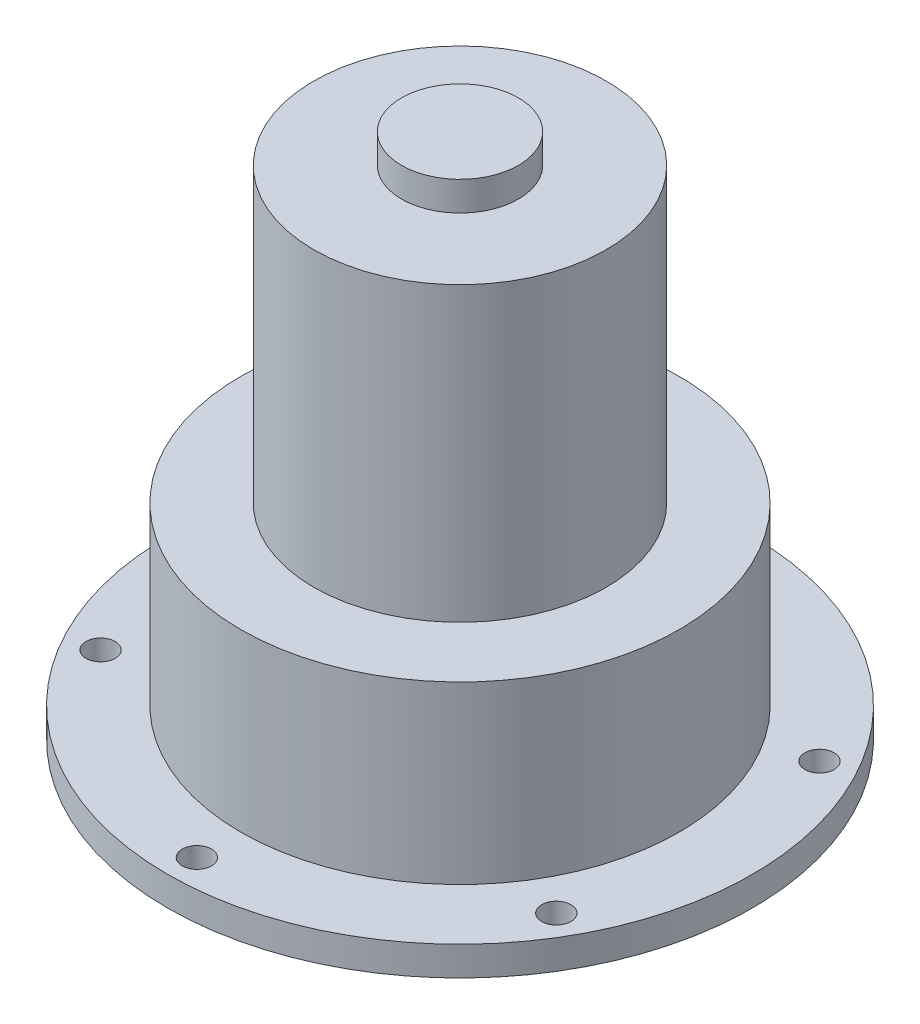
ISO-10303-21;
HEADER;
FILE_DESCRIPTION(('STEP AP214'),'2;1');
FILE_NAME('part.step','',(''),(''),'','','');
FILE_SCHEMA(('AUTOMOTIVE_DESIGN { 1 0 10303 214 1 1 1 1 }'));
ENDSEC;
DATA;
#1=APPLICATION_CONTEXT('core data for automotive mechanical design processes');
#2=APPLICATION_PROTOCOL_DEFINITION('international standard','automotive_design',2000,#1);
#3=PRODUCT_CONTEXT('',#1,'mechanical');
#4=PRODUCT('Part','Part','',(#3));
#5=PRODUCT_RELATED_PRODUCT_CATEGORY('part','',(#4));
#6=PRODUCT_DEFINITION_FORMATION('','',#4);
#7=PRODUCT_DEFINITION_CONTEXT('part definition',#1,'design');
#8=PRODUCT_DEFINITION('design','',#6,#7);
#9=PRODUCT_DEFINITION_SHAPE('','',#8);
#10=(LENGTH_UNIT() NAMED_UNIT(*) SI_UNIT(.MILLI.,.METRE.));
#11=(NAMED_UNIT(*) PLANE_ANGLE_UNIT() SI_UNIT($,.RADIAN.));
#12=(NAMED_UNIT(*) SI_UNIT($,.STERADIAN.) SOLID_ANGLE_UNIT());
#13=UNCERTAINTY_MEASURE_WITH_UNIT(LENGTH_MEASURE(1.E-05),#10,'distance_accuracy_value','');
#14=(GEOMETRIC_REPRESENTATION_CONTEXT(3) GLOBAL_UNCERTAINTY_ASSIGNED_CONTEXT((#13)) GLOBAL_UNIT_ASSIGNED_CONTEXT((#10,
#11,#12)) REPRESENTATION_CONTEXT('',''));
#15=CARTESIAN_POINT('',(0.,0.,0.));
#16=DIRECTION('',(0.,0.,1.));
#17=DIRECTION('',(1.,0.,0.));
#18=AXIS2_PLACEMENT_3D('',#15,#16,#17);
#19=CARTESIAN_POINT('',(0.,30.,0.));
#20=DIRECTION('',(0.,-1.,0.));
#21=DIRECTION('',(0.,0.,-1.));
#22=AXIS2_PLACEMENT_3D('',#19,#20,#21);
#23=CYLINDRICAL_SURFACE('',#22,37.5);
#24=CARTESIAN_POINT('',(0.,30.,0.));
#25=DIRECTION('',(0.,1.,0.));
#26=DIRECTION('',(0.,0.,1.));
#27=AXIS2_PLACEMENT_3D('',#24,#25,#26);
#28=CIRCLE('',#27,37.5);
#29=CARTESIAN_POINT('',(0.,30.,37.5));
#30=VERTEX_POINT('',#29);
#31=EDGE_CURVE('E43',#30,#30,#28,.T.);
#32=ORIENTED_EDGE('',*,*,#31,.F.);
#33=EDGE_LOOP('',(#32));
#34=FACE_BOUND('',#33,.T.);
#35=CARTESIAN_POINT('',(0.,0.,0.));
#36=DIRECTION('',(0.,1.,0.));
#37=DIRECTION('',(0.,0.,1.));
#38=AXIS2_PLACEMENT_3D('',#35,#36,#37);
#39=CIRCLE('',#38,37.5);
#40=CARTESIAN_POINT('',(0.,0.,37.5));
#41=VERTEX_POINT('',#40);
#42=EDGE_CURVE('E34',#41,#41,#39,.T.);
#43=ORIENTED_EDGE('',*,*,#42,.T.);
#44=EDGE_LOOP('',(#43));
#45=FACE_BOUND('',#44,.T.);
#46=ADVANCED_FACE('F31',(#34,#45),#23,.T.);
#47=CARTESIAN_POINT('',(0.,30.,0.));
#48=DIRECTION('',(0.,1.,0.));
#49=DIRECTION('',(0.,0.,1.));
#50=AXIS2_PLACEMENT_3D('',#47,#48,#49);
#51=PLANE('',#50);
#52=CARTESIAN_POINT('',(0.,30.,0.));
#53=DIRECTION('',(0.,1.,0.));
#54=DIRECTION('',(0.,0.,1.));
#55=AXIS2_PLACEMENT_3D('',#52,#53,#54);
#56=CIRCLE('',#55,25.);
#57=CARTESIAN_POINT('',(0.,30.,25.));
#58=VERTEX_POINT('',#57);
#59=EDGE_CURVE('E38',#58,#58,#56,.T.);
#60=ORIENTED_EDGE('',*,*,#59,.F.);
#61=EDGE_LOOP('',(#60));
#62=FACE_BOUND('',#61,.T.);
#63=ORIENTED_EDGE('',*,*,#31,.T.);
#64=EDGE_LOOP('',(#63));
#65=FACE_BOUND('',#64,.T.);
#66=ADVANCED_FACE('F54',(#62,#65),#51,.T.);
#67=CARTESIAN_POINT('',(0.,80.,0.));
#68=DIRECTION('',(0.,-1.,0.));
#69=DIRECTION('',(0.,0.,-1.));
#70=AXIS2_PLACEMENT_3D('',#67,#68,#69);
#71=CYLINDRICAL_SURFACE('',#70,25.);
#72=CARTESIAN_POINT('',(0.,80.,0.));
#73=DIRECTION('',(0.,1.,0.));
#74=DIRECTION('',(0.,0.,1.));
#75=AXIS2_PLACEMENT_3D('',#72,#73,#74);
#76=CIRCLE('',#75,25.);
#77=CARTESIAN_POINT('',(0.,80.,25.));
#78=VERTEX_POINT('',#77);
#79=EDGE_CURVE('E49',#78,#78,#76,.T.);
#80=ORIENTED_EDGE('',*,*,#79,.F.);
#81=EDGE_LOOP('',(#80));
#82=FACE_BOUND('',#81,.T.);
#83=ORIENTED_EDGE('',*,*,#59,.T.);
#84=EDGE_LOOP('',(#83));
#85=FACE_BOUND('',#84,.T.);
#86=ADVANCED_FACE('F169',(#82,#85),#71,.T.);
#87=CARTESIAN_POINT('',(0.,80.,0.));
#88=DIRECTION('',(0.,1.,0.));
#89=DIRECTION('',(0.,0.,1.));
#90=AXIS2_PLACEMENT_3D('',#87,#88,#89);
#91=PLANE('',#90);
#92=CARTESIAN_POINT('',(0.,80.,0.));
#93=DIRECTION('',(0.,1.,0.));
#94=DIRECTION('',(0.,0.,1.));
#95=AXIS2_PLACEMENT_3D('',#92,#93,#94);
#96=CIRCLE('',#95,10.);
#97=CARTESIAN_POINT('',(0.,80.,10.));
#98=VERTEX_POINT('',#97);
#99=EDGE_CURVE('E10',#98,#98,#96,.T.);
#100=ORIENTED_EDGE('',*,*,#99,.F.);
#101=EDGE_LOOP('',(#100));
#102=FACE_BOUND('',#101,.T.);
#103=ORIENTED_EDGE('',*,*,#79,.T.);
#104=EDGE_LOOP('',(#103));
#105=FACE_BOUND('',#104,.T.);
#106=ADVANCED_FACE('F165',(#102,#105),#91,.T.);
#107=CARTESIAN_POINT('',(0.,85.,0.));
#108=DIRECTION('',(0.,-1.,0.));
#109=DIRECTION('',(0.,0.,-1.));
#110=AXIS2_PLACEMENT_3D('',#107,#108,#109);
#111=CYLINDRICAL_SURFACE('',#110,10.);
#112=CARTESIAN_POINT('',(0.,85.,0.));
#113=DIRECTION('',(0.,1.,0.));
#114=DIRECTION('',(0.,0.,1.));
#115=AXIS2_PLACEMENT_3D('',#112,#113,#114);
#116=CIRCLE('',#115,10.);
#117=CARTESIAN_POINT('',(0.,85.,10.));
#118=VERTEX_POINT('',#117);
#119=EDGE_CURVE('E47',#118,#118,#116,.T.);
#120=ORIENTED_EDGE('',*,*,#119,.F.);
#121=EDGE_LOOP('',(#120));
#122=FACE_BOUND('',#121,.T.);
#123=ORIENTED_EDGE('',*,*,#99,.T.);
#124=EDGE_LOOP('',(#123));
#125=FACE_BOUND('',#124,.T.);
#126=ADVANCED_FACE('F161',(#122,#125),#111,.T.);
#127=CARTESIAN_POINT('',(0.,85.,0.));
#128=DIRECTION('',(0.,1.,0.));
#129=DIRECTION('',(0.,0.,1.));
#130=AXIS2_PLACEMENT_3D('',#127,#128,#129);
#131=PLANE('',#130);
#132=ORIENTED_EDGE('',*,*,#119,.T.);
#133=EDGE_LOOP('',(#132));
#134=FACE_BOUND('',#133,.T.);
#135=ADVANCED_FACE('F157',(#134),#131,.T.);
#136=CARTESIAN_POINT('',(0.,-5.,0.));
#137=DIRECTION('',(0.,1.,0.));
#138=DIRECTION('',(0.,0.,1.));
#139=AXIS2_PLACEMENT_3D('',#136,#137,#138);
#140=CYLINDRICAL_SURFACE('',#139,50.);
#141=CARTESIAN_POINT('',(0.,-5.,0.));
#142=DIRECTION('',(0.,-1.,0.));
#143=DIRECTION('',(0.,0.,-1.));
#144=AXIS2_PLACEMENT_3D('',#141,#142,#143);
#145=CIRCLE('',#144,50.);
#146=CARTESIAN_POINT('',(0.,-5.,-50.));
#147=VERTEX_POINT('',#146);
#148=EDGE_CURVE('E61',#147,#147,#145,.T.);
#149=ORIENTED_EDGE('',*,*,#148,.F.);
#150=EDGE_LOOP('',(#149));
#151=FACE_BOUND('',#150,.T.);
#152=CARTESIAN_POINT('',(0.,0.,0.));
#153=DIRECTION('',(0.,-1.,0.));
#154=DIRECTION('',(0.,0.,-1.));
#155=AXIS2_PLACEMENT_3D('',#152,#153,#154);
#156=CIRCLE('',#155,50.);
#157=CARTESIAN_POINT('',(0.,0.,-50.));
#158=VERTEX_POINT('',#157);
#159=EDGE_CURVE('E64',#158,#158,#156,.T.);
#160=ORIENTED_EDGE('',*,*,#159,.T.);
#161=EDGE_LOOP('',(#160));
#162=FACE_BOUND('',#161,.T.);
#163=ADVANCED_FACE('F120',(#151,#162),#140,.T.);
#164=CARTESIAN_POINT('',(0.,-5.,0.));
#165=DIRECTION('',(0.,-1.,0.));
#166=DIRECTION('',(0.,0.,-1.));
#167=AXIS2_PLACEMENT_3D('',#164,#165,#166);
#168=PLANE('',#167);
#169=CARTESIAN_POINT('',(0.,-5.,45.));
#170=DIRECTION('',(0.,-1.,0.));
#171=DIRECTION('',(0.,0.,-1.));
#172=AXIS2_PLACEMENT_3D('',#169,#170,#171);
#173=CIRCLE('',#172,2.5);
#174=CARTESIAN_POINT('',(0.,-5.,42.5));
#175=VERTEX_POINT('',#174);
#176=EDGE_CURVE('E96',#175,#175,#173,.T.);
#177=ORIENTED_EDGE('',*,*,#176,.F.);
#178=EDGE_LOOP('',(#177));
#179=FACE_BOUND('',#178,.T.);
#180=CARTESIAN_POINT('',(-38.9711431702988,-5.,22.4999999999983));
#181=DIRECTION('',(0.,-1.,0.));
#182=DIRECTION('',(0.,0.,-1.));
#183=AXIS2_PLACEMENT_3D('',#180,#181,#182);
#184=CIRCLE('',#183,2.50000000000193);
#185=CARTESIAN_POINT('',(-38.9711431702988,-5.,19.9999999999964));
#186=VERTEX_POINT('',#185);
#187=EDGE_CURVE('E97',#186,#186,#184,.T.);
#188=ORIENTED_EDGE('',*,*,#187,.F.);
#189=EDGE_LOOP('',(#188));
#190=FACE_BOUND('',#189,.T.);
#191=CARTESIAN_POINT('',(-38.9711431702969,-5.,-22.5000000000017));
#192=DIRECTION('',(0.,-1.,0.));
#193=DIRECTION('',(0.,0.,-1.));
#194=AXIS2_PLACEMENT_3D('',#191,#192,#193);
#195=CIRCLE('',#194,2.50000000000364);
#196=CARTESIAN_POINT('',(-38.9711431702969,-5.,-25.0000000000053));
#197=VERTEX_POINT('',#196);
#198=EDGE_CURVE('E71',#197,#197,#195,.T.);
#199=ORIENTED_EDGE('',*,*,#198,.F.);
#200=EDGE_LOOP('',(#199));
#201=FACE_BOUND('',#200,.T.);
#202=CARTESIAN_POINT('',(3.82039804131605E-12,-5.,-45.));
#203=DIRECTION('',(0.,-1.,0.));
#204=DIRECTION('',(0.,0.,-1.));
#205=AXIS2_PLACEMENT_3D('',#202,#203,#204);
#206=CIRCLE('',#205,2.50000000000396);
#207=CARTESIAN_POINT('',(3.82039804131605E-12,-5.,-47.500000000004));
#208=VERTEX_POINT('',#207);
#209=EDGE_CURVE('E78',#208,#208,#206,.T.);
#210=ORIENTED_EDGE('',*,*,#209,.F.);
#211=EDGE_LOOP('',(#210));
#212=FACE_BOUND('',#211,.T.);
#213=CARTESIAN_POINT('',(38.9711431703026,-5.,-22.4999999999983));
#214=DIRECTION('',(0.,-1.,0.));
#215=DIRECTION('',(0.,0.,-1.));
#216=AXIS2_PLACEMENT_3D('',#213,#214,#215);
#217=CIRCLE('',#216,2.50000000000246);
#218=CARTESIAN_POINT('',(38.9711431703026,-5.,-25.0000000000008));
#219=VERTEX_POINT('',#218);
#220=EDGE_CURVE('E84',#219,#219,#217,.T.);
#221=ORIENTED_EDGE('',*,*,#220,.F.);
#222=EDGE_LOOP('',(#221));
#223=FACE_BOUND('',#222,.T.);
#224=CARTESIAN_POINT('',(38.9711431703007,-5.,22.5000000000017));
#225=DIRECTION('',(0.,-1.,0.));
#226=DIRECTION('',(0.,0.,-1.));
#227=AXIS2_PLACEMENT_3D('',#224,#225,#226);
#228=CIRCLE('',#227,2.50000000000054);
#229=CARTESIAN_POINT('',(38.9711431703007,-5.,20.0000000000011));
#230=VERTEX_POINT('',#229);
#231=EDGE_CURVE('E90',#230,#230,#228,.T.);
#232=ORIENTED_EDGE('',*,*,#231,.F.);
#233=EDGE_LOOP('',(#232));
#234=FACE_BOUND('',#233,.T.);
#235=ORIENTED_EDGE('',*,*,#148,.T.);
#236=EDGE_LOOP('',(#235));
#237=FACE_BOUND('',#236,.T.);
#238=ADVANCED_FACE('F117',(#179,#190,#201,#212,#223,#234,#237),#168,.T.);
#239=CARTESIAN_POINT('',(0.,0.,0.));
#240=DIRECTION('',(0.,-1.,0.));
#241=DIRECTION('',(0.,0.,-1.));
#242=AXIS2_PLACEMENT_3D('',#239,#240,#241);
#243=PLANE('',#242);
#244=CARTESIAN_POINT('',(0.,0.,45.));
#245=DIRECTION('',(0.,-1.,0.));
#246=DIRECTION('',(0.,0.,-1.));
#247=AXIS2_PLACEMENT_3D('',#244,#245,#246);
#248=CIRCLE('',#247,2.5);
#249=CARTESIAN_POINT('',(0.,0.,42.5));
#250=VERTEX_POINT('',#249);
#251=EDGE_CURVE('E69',#250,#250,#248,.T.);
#252=ORIENTED_EDGE('',*,*,#251,.T.);
#253=EDGE_LOOP('',(#252));
#254=FACE_BOUND('',#253,.T.);
#255=CARTESIAN_POINT('',(-38.9711431702988,0.,22.4999999999983));
#256=DIRECTION('',(0.,-1.,0.));
#257=DIRECTION('',(0.,0.,-1.));
#258=AXIS2_PLACEMENT_3D('',#255,#256,#257);
#259=CIRCLE('',#258,2.50000000000193);
#260=CARTESIAN_POINT('',(-38.9711431702988,0.,19.9999999999964));
#261=VERTEX_POINT('',#260);
#262=EDGE_CURVE('E75',#261,#261,#259,.T.);
#263=ORIENTED_EDGE('',*,*,#262,.T.);
#264=EDGE_LOOP('',(#263));
#265=FACE_BOUND('',#264,.T.);
#266=CARTESIAN_POINT('',(-38.9711431702969,0.,-22.5000000000017));
#267=DIRECTION('',(0.,-1.,0.));
#268=DIRECTION('',(0.,0.,-1.));
#269=AXIS2_PLACEMENT_3D('',#266,#267,#268);
#270=CIRCLE('',#269,2.50000000000364);
#271=CARTESIAN_POINT('',(-38.9711431702969,0.,-25.0000000000053));
#272=VERTEX_POINT('',#271);
#273=EDGE_CURVE('E74',#272,#272,#270,.T.);
#274=ORIENTED_EDGE('',*,*,#273,.T.);
#275=EDGE_LOOP('',(#274));
#276=FACE_BOUND('',#275,.T.);
#277=CARTESIAN_POINT('',(3.82039804131605E-12,0.,-45.));
#278=DIRECTION('',(0.,-1.,0.));
#279=DIRECTION('',(0.,0.,-1.));
#280=AXIS2_PLACEMENT_3D('',#277,#278,#279);
#281=CIRCLE('',#280,2.50000000000396);
#282=CARTESIAN_POINT('',(3.82039804131605E-12,0.,-47.500000000004));
#283=VERTEX_POINT('',#282);
#284=EDGE_CURVE('E81',#283,#283,#281,.T.);
#285=ORIENTED_EDGE('',*,*,#284,.T.);
#286=EDGE_LOOP('',(#285));
#287=FACE_BOUND('',#286,.T.);
#288=CARTESIAN_POINT('',(38.9711431703026,0.,-22.4999999999983));
#289=DIRECTION('',(0.,-1.,0.));
#290=DIRECTION('',(0.,0.,-1.));
#291=AXIS2_PLACEMENT_3D('',#288,#289,#290);
#292=CIRCLE('',#291,2.50000000000246);
#293=CARTESIAN_POINT('',(38.9711431703026,0.,-25.0000000000008));
#294=VERTEX_POINT('',#293);
#295=EDGE_CURVE('E87',#294,#294,#292,.T.);
#296=ORIENTED_EDGE('',*,*,#295,.T.);
#297=EDGE_LOOP('',(#296));
#298=FACE_BOUND('',#297,.T.);
#299=CARTESIAN_POINT('',(38.9711431703007,0.,22.5000000000017));
#300=DIRECTION('',(0.,-1.,0.));
#301=DIRECTION('',(0.,0.,-1.));
#302=AXIS2_PLACEMENT_3D('',#299,#300,#301);
#303=CIRCLE('',#302,2.50000000000054);
#304=CARTESIAN_POINT('',(38.9711431703007,0.,20.0000000000011));
#305=VERTEX_POINT('',#304);
#306=EDGE_CURVE('E93',#305,#305,#303,.T.);
#307=ORIENTED_EDGE('',*,*,#306,.T.);
#308=EDGE_LOOP('',(#307));
#309=FACE_BOUND('',#308,.T.);
#310=ORIENTED_EDGE('',*,*,#42,.F.);
#311=EDGE_LOOP('',(#310));
#312=FACE_BOUND('',#311,.T.);
#313=ORIENTED_EDGE('',*,*,#159,.F.);
#314=EDGE_LOOP('',(#313));
#315=FACE_BOUND('',#314,.T.);
#316=ADVANCED_FACE('F107',(#254,#265,#276,#287,#298,#309,#312,#315),#243,.F.);
#317=CARTESIAN_POINT('',(38.9711431703007,0.,22.5000000000017));
#318=DIRECTION('',(0.,-1.,0.));
#319=DIRECTION('',(0.,0.,-1.));
#320=AXIS2_PLACEMENT_3D('',#317,#318,#319);
#321=CYLINDRICAL_SURFACE('',#320,2.50000000000054);
#322=ORIENTED_EDGE('',*,*,#306,.F.);
#323=EDGE_LOOP('',(#322));
#324=FACE_BOUND('',#323,.T.);
#325=ORIENTED_EDGE('',*,*,#231,.T.);
#326=EDGE_LOOP('',(#325));
#327=FACE_BOUND('',#326,.T.);
#328=ADVANCED_FACE('F132',(#324,#327),#321,.F.);
#329=CARTESIAN_POINT('',(38.9711431703026,0.,-22.4999999999983));
#330=DIRECTION('',(0.,-1.,0.));
#331=DIRECTION('',(0.,0.,-1.));
#332=AXIS2_PLACEMENT_3D('',#329,#330,#331);
#333=CYLINDRICAL_SURFACE('',#332,2.50000000000246);
#334=ORIENTED_EDGE('',*,*,#295,.F.);
#335=EDGE_LOOP('',(#334));
#336=FACE_BOUND('',#335,.T.);
#337=ORIENTED_EDGE('',*,*,#220,.T.);
#338=EDGE_LOOP('',(#337));
#339=FACE_BOUND('',#338,.T.);
#340=ADVANCED_FACE('F134',(#336,#339),#333,.F.);
#341=CARTESIAN_POINT('',(3.82039804131605E-12,0.,-45.));
#342=DIRECTION('',(0.,-1.,0.));
#343=DIRECTION('',(0.,0.,-1.));
#344=AXIS2_PLACEMENT_3D('',#341,#342,#343);
#345=CYLINDRICAL_SURFACE('',#344,2.50000000000396);
#346=ORIENTED_EDGE('',*,*,#284,.F.);
#347=EDGE_LOOP('',(#346));
#348=FACE_BOUND('',#347,.T.);
#349=ORIENTED_EDGE('',*,*,#209,.T.);
#350=EDGE_LOOP('',(#349));
#351=FACE_BOUND('',#350,.T.);
#352=ADVANCED_FACE('F141',(#348,#351),#345,.F.);
#353=CARTESIAN_POINT('',(-38.9711431702969,0.,-22.5000000000017));
#354=DIRECTION('',(0.,-1.,0.));
#355=DIRECTION('',(0.,0.,-1.));
#356=AXIS2_PLACEMENT_3D('',#353,#354,#355);
#357=CYLINDRICAL_SURFACE('',#356,2.50000000000364);
#358=ORIENTED_EDGE('',*,*,#273,.F.);
#359=EDGE_LOOP('',(#358));
#360=FACE_BOUND('',#359,.T.);
#361=ORIENTED_EDGE('',*,*,#198,.T.);
#362=EDGE_LOOP('',(#361));
#363=FACE_BOUND('',#362,.T.);
#364=ADVANCED_FACE('F150',(#360,#363),#357,.F.);
#365=CARTESIAN_POINT('',(-38.9711431702988,0.,22.4999999999983));
#366=DIRECTION('',(0.,-1.,0.));
#367=DIRECTION('',(0.,0.,-1.));
#368=AXIS2_PLACEMENT_3D('',#365,#366,#367);
#369=CYLINDRICAL_SURFACE('',#368,2.50000000000193);
#370=ORIENTED_EDGE('',*,*,#262,.F.);
#371=EDGE_LOOP('',(#370));
#372=FACE_BOUND('',#371,.T.);
#373=ORIENTED_EDGE('',*,*,#187,.T.);
#374=EDGE_LOOP('',(#373));
#375=FACE_BOUND('',#374,.T.);
#376=ADVANCED_FACE('F113',(#372,#375),#369,.F.);
#377=CARTESIAN_POINT('',(0.,0.,45.));
#378=DIRECTION('',(0.,-1.,0.));
#379=DIRECTION('',(0.,0.,-1.));
#380=AXIS2_PLACEMENT_3D('',#377,#378,#379);
#381=CYLINDRICAL_SURFACE('',#380,2.5);
#382=ORIENTED_EDGE('',*,*,#251,.F.);
#383=EDGE_LOOP('',(#382));
#384=FACE_BOUND('',#383,.T.);
#385=ORIENTED_EDGE('',*,*,#176,.T.);
#386=EDGE_LOOP('',(#385));
#387=FACE_BOUND('',#386,.T.);
#388=ADVANCED_FACE('F110',(#384,#387),#381,.F.);
#389=CLOSED_SHELL('',(#46,#66,#86,#106,#126,#135,#163,#238,#316,#328,#340,#352,#364,#376,#388));
#390=MANIFOLD_SOLID_BREP('B2',#389);
#391=ADVANCED_BREP_SHAPE_REPRESENTATION('',(#18,#390),#14);
#392=SHAPE_DEFINITION_REPRESENTATION(#9,#391);
ENDSEC;
END-ISO-10303-21;
